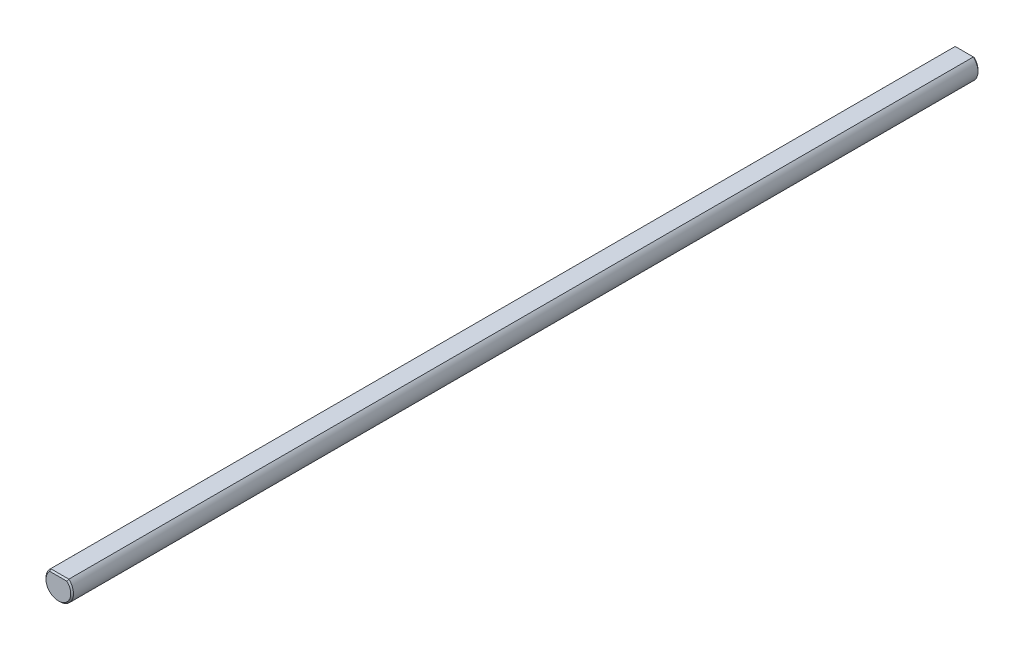
ISO-10303-21;
HEADER;
FILE_DESCRIPTION(('STEP AP214'),'2;1');
FILE_NAME('part.step','',(''),(''),'','','');
FILE_SCHEMA(('AUTOMOTIVE_DESIGN { 1 0 10303 214 1 1 1 1 }'));
ENDSEC;
DATA;
#1=APPLICATION_CONTEXT('core data for automotive mechanical design processes');
#2=APPLICATION_PROTOCOL_DEFINITION('international standard','automotive_design',2000,#1);
#3=PRODUCT_CONTEXT('',#1,'mechanical');
#4=PRODUCT('Part','Part','',(#3));
#5=PRODUCT_RELATED_PRODUCT_CATEGORY('part','',(#4));
#6=PRODUCT_DEFINITION_FORMATION('','',#4);
#7=PRODUCT_DEFINITION_CONTEXT('part definition',#1,'design');
#8=PRODUCT_DEFINITION('design','',#6,#7);
#9=PRODUCT_DEFINITION_SHAPE('','',#8);
#10=(LENGTH_UNIT() NAMED_UNIT(*) SI_UNIT(.MILLI.,.METRE.));
#11=(NAMED_UNIT(*) PLANE_ANGLE_UNIT() SI_UNIT($,.RADIAN.));
#12=(NAMED_UNIT(*) SI_UNIT($,.STERADIAN.) SOLID_ANGLE_UNIT());
#13=UNCERTAINTY_MEASURE_WITH_UNIT(LENGTH_MEASURE(1.E-05),#10,'distance_accuracy_value','');
#14=(GEOMETRIC_REPRESENTATION_CONTEXT(3) GLOBAL_UNCERTAINTY_ASSIGNED_CONTEXT((#13)) GLOBAL_UNIT_ASSIGNED_CONTEXT((#10,
#11,#12)) REPRESENTATION_CONTEXT('',''));
#15=CARTESIAN_POINT('',(0.,0.,0.));
#16=DIRECTION('',(0.,0.,1.));
#17=DIRECTION('',(1.,0.,0.));
#18=AXIS2_PLACEMENT_3D('',#15,#16,#17);
#19=CARTESIAN_POINT('',(0.,1.5,131.8));
#20=DIRECTION('',(0.,-0.707106781186597,-0.707106781186499));
#21=DIRECTION('',(0.,0.707106781186499,-0.707106781186597));
#22=AXIS2_PLACEMENT_3D('',#19,#20,#21);
#23=PLANE('',#22);
#24=CARTESIAN_POINT('',(-1.2449899598085,1.2999999999955,132.000000000004));
#25=CARTESIAN_POINT('',(-1.25833682020636,1.3332621136629,131.966737886337));
#26=CARTESIAN_POINT('',(-1.27150073005148,1.36655985040759,131.933440149592));
#27=CARTESIAN_POINT('',(-1.29746262804696,1.43322651718098,131.866773482819));
#28=CARTESIAN_POINT('',(-1.31026061677769,1.46659544709667,131.833404552903));
#29=CARTESIAN_POINT('',(-1.32287565553604,1.49999999997665,131.800000000023));
#30=B_SPLINE_CURVE_WITH_KNOTS('',3,(#24,#25,#26,#27,#28,#29),.UNSPECIFIED.,.F.,.F.,(4,2,4),(0.,
0.146686412470371,0.293372592279199),.UNSPECIFIED.);
#31=CARTESIAN_POINT('',(-1.24498995981286,1.29999999999444,132.000000000002));
#32=VERTEX_POINT('',#31);
#33=CARTESIAN_POINT('',(-1.32287565553995,1.49999999998837,131.800000000012));
#34=VERTEX_POINT('',#33);
#35=EDGE_CURVE('E82',#32,#34,#30,.T.);
#36=ORIENTED_EDGE('',*,*,#35,.F.);
#37=DIRECTION('',(1.,0.,0.));
#38=VECTOR('',#37,1.);
#39=CARTESIAN_POINT('',(0.,1.29999999999338,132.));
#40=LINE('',#39,#38);
#41=CARTESIAN_POINT('',(1.24498995980925,1.29999999999444,132.000000000005));
#42=VERTEX_POINT('',#41);
#43=EDGE_CURVE('E70',#42,#32,#40,.F.);
#44=ORIENTED_EDGE('',*,*,#43,.F.);
#45=CARTESIAN_POINT('',(1.32287565553556,1.49999999997687,131.800000000023));
#46=CARTESIAN_POINT('',(1.31026061677739,1.46659544709684,131.833404552903));
#47=CARTESIAN_POINT('',(1.29746262804683,1.43322651718108,131.866773482819));
#48=CARTESIAN_POINT('',(1.27150073005165,1.3665598504076,131.933440149592));
#49=CARTESIAN_POINT('',(1.25833682020666,1.33326211366287,131.966737886337));
#50=CARTESIAN_POINT('',(1.24498995980892,1.29999999999542,132.000000000005));
#51=B_SPLINE_CURVE_WITH_KNOTS('',3,(#45,#46,#47,#48,#49,#50),.UNSPECIFIED.,.F.,.F.,(4,2,4),(0.,
0.146686179808924,0.293372592279372),.UNSPECIFIED.);
#52=CARTESIAN_POINT('',(1.32287565553393,1.49999999998844,131.800000000012));
#53=VERTEX_POINT('',#52);
#54=EDGE_CURVE('E76',#53,#42,#51,.T.);
#55=ORIENTED_EDGE('',*,*,#54,.F.);
#56=DIRECTION('',(1.,0.,0.));
#57=VECTOR('',#56,1.);
#58=CARTESIAN_POINT('',(0.,1.5,131.8));
#59=LINE('',#58,#57);
#60=EDGE_CURVE('E84',#34,#53,#59,.T.);
#61=ORIENTED_EDGE('',*,*,#60,.F.);
#62=EDGE_LOOP('',(#36,#44,#55,#61));
#63=FACE_BOUND('',#62,.T.);
#64=ADVANCED_FACE('F17',(#63),#23,.F.);
#65=CARTESIAN_POINT('',(0.,1.29999999999999,0.));
#66=DIRECTION('',(0.,0.707106781186597,-0.707106781186499));
#67=DIRECTION('',(0.,0.707106781186499,0.707106781186597));
#68=AXIS2_PLACEMENT_3D('',#65,#66,#67);
#69=PLANE('',#68);
#70=CARTESIAN_POINT('',(1.32287565545622,1.50000000001432,0.200000000007953));
#71=CARTESIAN_POINT('',(1.31026061669769,1.46659544713122,0.166595447128049));
#72=CARTESIAN_POINT('',(1.29746262796695,1.4332265172129,0.133226517211856));
#73=CARTESIAN_POINT('',(1.27150072997176,1.36655985043527,0.0665598504363495));
#74=CARTESIAN_POINT('',(1.25833682012695,1.33326211368896,0.0332621136900403));
#75=CARTESIAN_POINT('',(1.24498995972956,1.30000000002044,2.04471058354037E-11));
#76=B_SPLINE_CURVE_WITH_KNOTS('',3,(#70,#71,#72,#73,#74,#75),.UNSPECIFIED.,.F.,.F.,(4,2,4),(0.,
0.146686179815209,0.293372592291946),.UNSPECIFIED.);
#77=CARTESIAN_POINT('',(1.32287565549414,1.50000000000547,0.200000000006324));
#78=VERTEX_POINT('',#77);
#79=CARTESIAN_POINT('',(1.24498995976611,1.30000000001027,3.86913239935393E-11));
#80=VERTEX_POINT('',#79);
#81=EDGE_CURVE('E80',#78,#80,#76,.T.);
#82=ORIENTED_EDGE('',*,*,#81,.T.);
#83=DIRECTION('',(1.,0.,0.));
#84=VECTOR('',#83,1.);
#85=CARTESIAN_POINT('',(0.,1.30000000000001,0.));
#86=LINE('',#85,#84);
#87=CARTESIAN_POINT('',(-1.24498995976611,1.30000000001027,3.8691488987854E-11));
#88=VERTEX_POINT('',#87);
#89=EDGE_CURVE('E93',#80,#88,#86,.F.);
#90=ORIENTED_EDGE('',*,*,#89,.T.);
#91=CARTESIAN_POINT('',(-1.24498995973036,1.30000000002353,1.70580490403209E-11));
#92=CARTESIAN_POINT('',(-1.25833682012743,1.33326211369101,0.0332621136877766));
#93=CARTESIAN_POINT('',(-1.27150072997198,1.36655985043626,0.0665598504351976));
#94=CARTESIAN_POINT('',(-1.29746262796669,1.4332265172118,0.133226517212902));
#95=CARTESIAN_POINT('',(-1.31026061669722,1.46659544712907,0.166595447130181));
#96=CARTESIAN_POINT('',(-1.32287565545558,1.50000000001113,0.200000000011158));
#97=B_SPLINE_CURVE_WITH_KNOTS('',3,(#91,#92,#93,#94,#95,#96),.UNSPECIFIED.,.F.,.F.,(4,2,4),(0.,
0.146686412476649,0.293372592291776),.UNSPECIFIED.);
#98=CARTESIAN_POINT('',(-1.32287565549535,1.50000000000487,0.200000000006267));
#99=VERTEX_POINT('',#98);
#100=EDGE_CURVE('E21',#88,#99,#97,.T.);
#101=ORIENTED_EDGE('',*,*,#100,.T.);
#102=DIRECTION('',(1.,0.,0.));
#103=VECTOR('',#102,1.);
#104=CARTESIAN_POINT('',(0.,1.5,0.200000000001282));
#105=LINE('',#104,#103);
#106=EDGE_CURVE('E90',#78,#99,#105,.F.);
#107=ORIENTED_EDGE('',*,*,#106,.F.);
#108=EDGE_LOOP('',(#82,#90,#101,#107));
#109=FACE_BOUND('',#108,.T.);
#110=ADVANCED_FACE('F121',(#109),#69,.T.);
#111=CARTESIAN_POINT('',(0.,0.,132.));
#112=DIRECTION('',(0.,0.,1.));
#113=DIRECTION('',(1.,0.,0.));
#114=AXIS2_PLACEMENT_3D('',#111,#112,#113);
#115=PLANE('',#114);
#116=ORIENTED_EDGE('',*,*,#43,.T.);
#117=CARTESIAN_POINT('',(0.,0.,132.000000000005));
#118=DIRECTION('',(0.,0.,-1.));
#119=DIRECTION('',(-1.,0.,0.));
#120=AXIS2_PLACEMENT_3D('',#117,#118,#119);
#121=CIRCLE('',#120,1.80000000000291);
#122=EDGE_CURVE('E65',#42,#32,#121,.T.);
#123=ORIENTED_EDGE('',*,*,#122,.F.);
#124=EDGE_LOOP('',(#116,#123));
#125=FACE_BOUND('',#124,.T.);
#126=ADVANCED_FACE('F68',(#125),#115,.T.);
#127=CARTESIAN_POINT('',(0.,1.5,132.));
#128=DIRECTION('',(0.,1.,0.));
#129=DIRECTION('',(0.,0.,1.));
#130=AXIS2_PLACEMENT_3D('',#127,#128,#129);
#131=PLANE('',#130);
#132=DIRECTION('',(0.,0.,-1.));
#133=VECTOR('',#132,1.);
#134=CARTESIAN_POINT('',(1.32287565553319,1.49999999999921,132.));
#135=LINE('',#134,#133);
#136=EDGE_CURVE('E73',#78,#53,#135,.F.);
#137=ORIENTED_EDGE('',*,*,#136,.F.);
#138=ORIENTED_EDGE('',*,*,#106,.T.);
#139=DIRECTION('',(0.,0.,-1.));
#140=VECTOR('',#139,1.);
#141=CARTESIAN_POINT('',(-1.32287565553566,1.49999999999703,132.));
#142=LINE('',#141,#140);
#143=EDGE_CURVE('E72',#34,#99,#142,.T.);
#144=ORIENTED_EDGE('',*,*,#143,.F.);
#145=ORIENTED_EDGE('',*,*,#60,.T.);
#146=EDGE_LOOP('',(#137,#138,#144,#145));
#147=FACE_BOUND('',#146,.T.);
#148=ADVANCED_FACE('F116',(#147),#131,.T.);
#149=CARTESIAN_POINT('',(0.,0.,0.));
#150=DIRECTION('',(0.,0.,1.));
#151=DIRECTION('',(1.,0.,0.));
#152=AXIS2_PLACEMENT_3D('',#149,#150,#151);
#153=PLANE('',#152);
#154=CARTESIAN_POINT('',(0.,0.,5.68433917557537E-11));
#155=DIRECTION('',(0.,0.,1.));
#156=DIRECTION('',(0.,-1.,0.));
#157=AXIS2_PLACEMENT_3D('',#154,#155,#156);
#158=CIRCLE('',#157,1.80000000000291);
#159=EDGE_CURVE('E51',#88,#80,#158,.T.);
#160=ORIENTED_EDGE('',*,*,#159,.F.);
#161=ORIENTED_EDGE('',*,*,#89,.F.);
#162=EDGE_LOOP('',(#160,#161));
#163=FACE_BOUND('',#162,.T.);
#164=ADVANCED_FACE('F110',(#163),#153,.F.);
#165=CARTESIAN_POINT('',(0.,0.,131.800000000112));
#166=DIRECTION('',(0.,0.,-1.));
#167=DIRECTION('',(-1.,0.,0.));
#168=AXIS2_PLACEMENT_3D('',#165,#166,#167);
#169=CONICAL_SURFACE('',#168,1.99999999989586,0.785398163397448);
#170=ORIENTED_EDGE('',*,*,#122,.T.);
#171=ORIENTED_EDGE('',*,*,#35,.T.);
#172=CARTESIAN_POINT('',(0.,0.,131.8));
#173=DIRECTION('',(0.,0.,-1.));
#174=DIRECTION('',(-1.,0.,0.));
#175=AXIS2_PLACEMENT_3D('',#172,#173,#174);
#176=CIRCLE('',#175,2.);
#177=EDGE_CURVE('E31',#53,#34,#176,.T.);
#178=ORIENTED_EDGE('',*,*,#177,.F.);
#179=ORIENTED_EDGE('',*,*,#54,.T.);
#180=EDGE_LOOP('',(#170,#171,#178,#179));
#181=FACE_BOUND('',#180,.T.);
#182=ADVANCED_FACE('F77',(#181),#169,.T.);
#183=CARTESIAN_POINT('',(0.,0.,0.200000000006639));
#184=DIRECTION('',(0.,0.,1.));
#185=DIRECTION('',(0.,-1.,0.));
#186=AXIS2_PLACEMENT_3D('',#183,#184,#185);
#187=CONICAL_SURFACE('',#186,1.99999999995271,0.785398163397448);
#188=ORIENTED_EDGE('',*,*,#81,.F.);
#189=CARTESIAN_POINT('',(0.,0.,0.200000000000033));
#190=DIRECTION('',(0.,0.,-1.));
#191=DIRECTION('',(-1.,0.,0.));
#192=AXIS2_PLACEMENT_3D('',#189,#190,#191);
#193=CIRCLE('',#192,2.);
#194=EDGE_CURVE('E10',#99,#78,#193,.F.);
#195=ORIENTED_EDGE('',*,*,#194,.F.);
#196=ORIENTED_EDGE('',*,*,#100,.F.);
#197=ORIENTED_EDGE('',*,*,#159,.T.);
#198=EDGE_LOOP('',(#188,#195,#196,#197));
#199=FACE_BOUND('',#198,.T.);
#200=ADVANCED_FACE('F109',(#199),#187,.T.);
#201=CARTESIAN_POINT('',(0.,0.,132.));
#202=DIRECTION('',(0.,0.,-1.));
#203=DIRECTION('',(-1.,0.,0.));
#204=AXIS2_PLACEMENT_3D('',#201,#202,#203);
#205=CYLINDRICAL_SURFACE('',#204,2.);
#206=ORIENTED_EDGE('',*,*,#194,.T.);
#207=ORIENTED_EDGE('',*,*,#136,.T.);
#208=ORIENTED_EDGE('',*,*,#177,.T.);
#209=ORIENTED_EDGE('',*,*,#143,.T.);
#210=EDGE_LOOP('',(#206,#207,#208,#209));
#211=FACE_BOUND('',#210,.T.);
#212=ADVANCED_FACE('F135',(#211),#205,.T.);
#213=CLOSED_SHELL('',(#64,#110,#126,#148,#164,#182,#200,#212));
#214=MANIFOLD_SOLID_BREP('B1',#213);
#215=ADVANCED_BREP_SHAPE_REPRESENTATION('',(#18,#214),#14);
#216=SHAPE_DEFINITION_REPRESENTATION(#9,#215);
ENDSEC;
END-ISO-10303-21;
